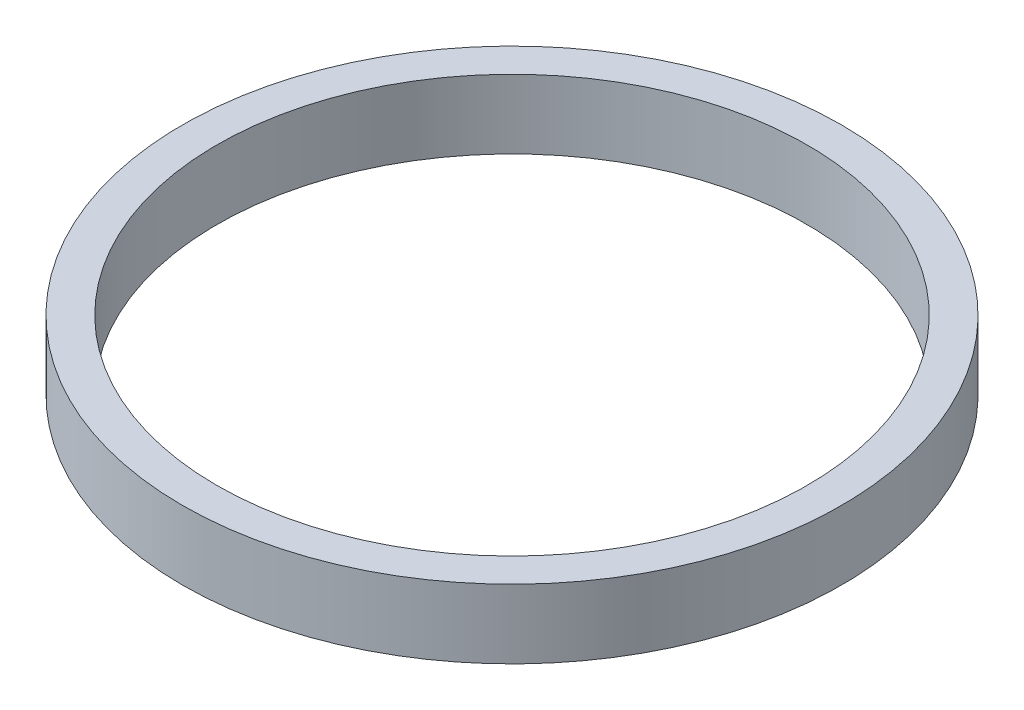
ISO-10303-21;
HEADER;
FILE_DESCRIPTION(('STEP AP214'),'2;1');
FILE_NAME('part.step','',(''),(''),'','','');
FILE_SCHEMA(('AUTOMOTIVE_DESIGN { 1 0 10303 214 1 1 1 1 }'));
ENDSEC;
DATA;
#1=APPLICATION_CONTEXT('core data for automotive mechanical design processes');
#2=APPLICATION_PROTOCOL_DEFINITION('international standard','automotive_design',2000,#1);
#3=PRODUCT_CONTEXT('',#1,'mechanical');
#4=PRODUCT('Part','Part','',(#3));
#5=PRODUCT_RELATED_PRODUCT_CATEGORY('part','',(#4));
#6=PRODUCT_DEFINITION_FORMATION('','',#4);
#7=PRODUCT_DEFINITION_CONTEXT('part definition',#1,'design');
#8=PRODUCT_DEFINITION('design','',#6,#7);
#9=PRODUCT_DEFINITION_SHAPE('','',#8);
#10=(LENGTH_UNIT() NAMED_UNIT(*) SI_UNIT(.MILLI.,.METRE.));
#11=(NAMED_UNIT(*) PLANE_ANGLE_UNIT() SI_UNIT($,.RADIAN.));
#12=(NAMED_UNIT(*) SI_UNIT($,.STERADIAN.) SOLID_ANGLE_UNIT());
#13=UNCERTAINTY_MEASURE_WITH_UNIT(LENGTH_MEASURE(1.E-05),#10,'distance_accuracy_value','');
#14=(GEOMETRIC_REPRESENTATION_CONTEXT(3) GLOBAL_UNCERTAINTY_ASSIGNED_CONTEXT((#13)) GLOBAL_UNIT_ASSIGNED_CONTEXT((#10,
#11,#12)) REPRESENTATION_CONTEXT('',''));
#15=CARTESIAN_POINT('',(0.,0.,0.));
#16=DIRECTION('',(0.,0.,1.));
#17=DIRECTION('',(1.,0.,0.));
#18=AXIS2_PLACEMENT_3D('',#15,#16,#17);
#19=CARTESIAN_POINT('',(0.,10.,0.));
#20=DIRECTION('',(0.,1.,0.));
#21=DIRECTION('',(0.,0.,1.));
#22=AXIS2_PLACEMENT_3D('',#19,#20,#21);
#23=PLANE('',#22);
#24=CARTESIAN_POINT('',(0.,10.,0.));
#25=DIRECTION('',(0.,1.,0.));
#26=DIRECTION('',(0.,0.,1.));
#27=AXIS2_PLACEMENT_3D('',#24,#25,#26);
#28=CIRCLE('',#27,47.75);
#29=CARTESIAN_POINT('',(0.,10.,47.75));
#30=VERTEX_POINT('',#29);
#31=EDGE_CURVE('E10',#30,#30,#28,.T.);
#32=ORIENTED_EDGE('',*,*,#31,.T.);
#33=EDGE_LOOP('',(#32));
#34=FACE_BOUND('',#33,.T.);
#35=CARTESIAN_POINT('',(0.,10.,0.));
#36=DIRECTION('',(0.,1.,0.));
#37=DIRECTION('',(0.,0.,1.));
#38=AXIS2_PLACEMENT_3D('',#35,#36,#37);
#39=CIRCLE('',#38,42.75);
#40=CARTESIAN_POINT('',(0.,10.,42.75));
#41=VERTEX_POINT('',#40);
#42=EDGE_CURVE('E54',#41,#41,#39,.T.);
#43=ORIENTED_EDGE('',*,*,#42,.F.);
#44=EDGE_LOOP('',(#43));
#45=FACE_BOUND('',#44,.T.);
#46=ADVANCED_FACE('F41',(#34,#45),#23,.T.);
#47=CARTESIAN_POINT('',(0.,0.,0.));
#48=DIRECTION('',(0.,1.,0.));
#49=DIRECTION('',(0.,0.,1.));
#50=AXIS2_PLACEMENT_3D('',#47,#48,#49);
#51=PLANE('',#50);
#52=CARTESIAN_POINT('',(0.,0.,0.));
#53=DIRECTION('',(0.,1.,0.));
#54=DIRECTION('',(0.,0.,1.));
#55=AXIS2_PLACEMENT_3D('',#52,#53,#54);
#56=CIRCLE('',#55,47.75);
#57=CARTESIAN_POINT('',(0.,0.,47.75));
#58=VERTEX_POINT('',#57);
#59=EDGE_CURVE('E45',#58,#58,#56,.T.);
#60=ORIENTED_EDGE('',*,*,#59,.F.);
#61=EDGE_LOOP('',(#60));
#62=FACE_BOUND('',#61,.T.);
#63=CARTESIAN_POINT('',(0.,0.,0.));
#64=DIRECTION('',(0.,1.,0.));
#65=DIRECTION('',(0.,0.,1.));
#66=AXIS2_PLACEMENT_3D('',#63,#64,#65);
#67=CIRCLE('',#66,42.75);
#68=CARTESIAN_POINT('',(0.,0.,42.75));
#69=VERTEX_POINT('',#68);
#70=EDGE_CURVE('E56',#69,#69,#67,.T.);
#71=ORIENTED_EDGE('',*,*,#70,.T.);
#72=EDGE_LOOP('',(#71));
#73=FACE_BOUND('',#72,.T.);
#74=ADVANCED_FACE('F68',(#62,#73),#51,.F.);
#75=CARTESIAN_POINT('',(0.,10.,0.));
#76=DIRECTION('',(0.,-1.,0.));
#77=DIRECTION('',(0.,0.,-1.));
#78=AXIS2_PLACEMENT_3D('',#75,#76,#77);
#79=CYLINDRICAL_SURFACE('',#78,47.75);
#80=ORIENTED_EDGE('',*,*,#31,.F.);
#81=EDGE_LOOP('',(#80));
#82=FACE_BOUND('',#81,.T.);
#83=ORIENTED_EDGE('',*,*,#59,.T.);
#84=EDGE_LOOP('',(#83));
#85=FACE_BOUND('',#84,.T.);
#86=ADVANCED_FACE('F43',(#82,#85),#79,.T.);
#87=CARTESIAN_POINT('',(0.,10.,0.));
#88=DIRECTION('',(0.,-1.,0.));
#89=DIRECTION('',(0.,0.,-1.));
#90=AXIS2_PLACEMENT_3D('',#87,#88,#89);
#91=CYLINDRICAL_SURFACE('',#90,42.75);
#92=ORIENTED_EDGE('',*,*,#42,.T.);
#93=EDGE_LOOP('',(#92));
#94=FACE_BOUND('',#93,.T.);
#95=ORIENTED_EDGE('',*,*,#70,.F.);
#96=EDGE_LOOP('',(#95));
#97=FACE_BOUND('',#96,.T.);
#98=ADVANCED_FACE('F64',(#94,#97),#91,.F.);
#99=CLOSED_SHELL('',(#46,#74,#86,#98));
#100=MANIFOLD_SOLID_BREP('B2',#99);
#101=ADVANCED_BREP_SHAPE_REPRESENTATION('',(#18,#100),#14);
#102=SHAPE_DEFINITION_REPRESENTATION(#9,#101);
ENDSEC;
END-ISO-10303-21;
